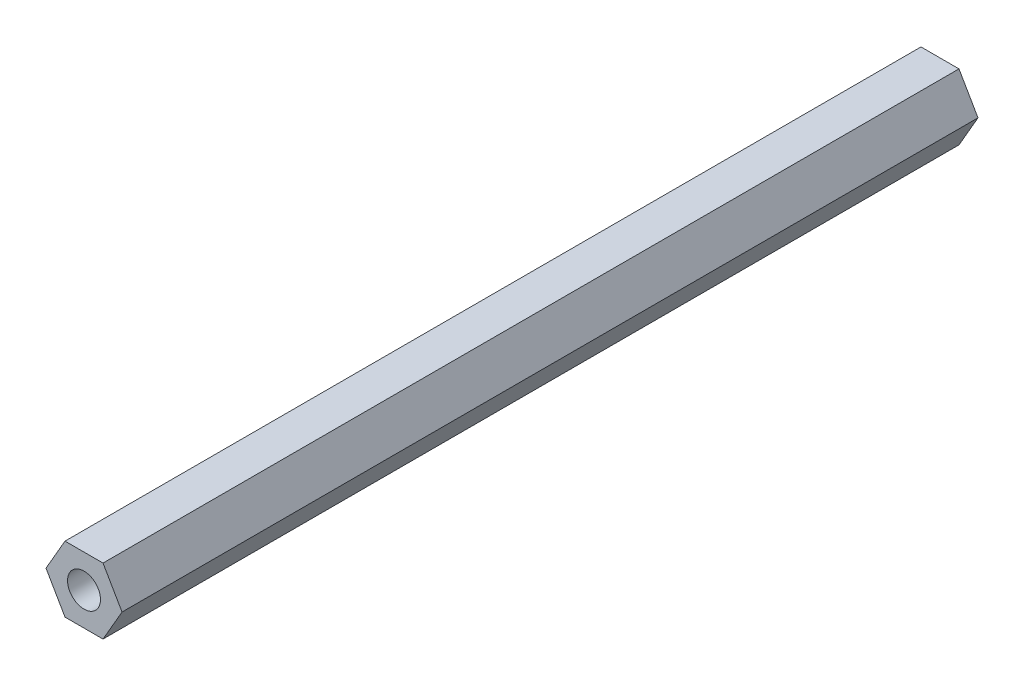
ISO-10303-21;
HEADER;
FILE_DESCRIPTION(('STEP AP214'),'2;1');
FILE_NAME('part.step','',(''),(''),'','','');
FILE_SCHEMA(('AUTOMOTIVE_DESIGN { 1 0 10303 214 1 1 1 1 }'));
ENDSEC;
DATA;
#1=APPLICATION_CONTEXT('core data for automotive mechanical design processes');
#2=APPLICATION_PROTOCOL_DEFINITION('international standard','automotive_design',2000,#1);
#3=PRODUCT_CONTEXT('',#1,'mechanical');
#4=PRODUCT('Part','Part','',(#3));
#5=PRODUCT_RELATED_PRODUCT_CATEGORY('part','',(#4));
#6=PRODUCT_DEFINITION_FORMATION('','',#4);
#7=PRODUCT_DEFINITION_CONTEXT('part definition',#1,'design');
#8=PRODUCT_DEFINITION('design','',#6,#7);
#9=PRODUCT_DEFINITION_SHAPE('','',#8);
#10=(LENGTH_UNIT() NAMED_UNIT(*) SI_UNIT(.MILLI.,.METRE.));
#11=(NAMED_UNIT(*) PLANE_ANGLE_UNIT() SI_UNIT($,.RADIAN.));
#12=(NAMED_UNIT(*) SI_UNIT($,.STERADIAN.) SOLID_ANGLE_UNIT());
#13=UNCERTAINTY_MEASURE_WITH_UNIT(LENGTH_MEASURE(1.E-05),#10,'distance_accuracy_value','');
#14=(GEOMETRIC_REPRESENTATION_CONTEXT(3) GLOBAL_UNCERTAINTY_ASSIGNED_CONTEXT((#13)) GLOBAL_UNIT_ASSIGNED_CONTEXT((#10,
#11,#12)) REPRESENTATION_CONTEXT('',''));
#15=CARTESIAN_POINT('',(0.,0.,0.));
#16=DIRECTION('',(0.,0.,1.));
#17=DIRECTION('',(1.,0.,0.));
#18=AXIS2_PLACEMENT_3D('',#15,#16,#17);
#19=CARTESIAN_POINT('',(0.,-2.5,65.));
#20=DIRECTION('',(0.,1.,0.));
#21=DIRECTION('',(-1.,0.,0.));
#22=AXIS2_PLACEMENT_3D('',#19,#20,#21);
#23=PLANE('',#22);
#24=DIRECTION('',(1.,0.,0.));
#25=VECTOR('',#24,1.);
#26=CARTESIAN_POINT('',(0.,-2.5,0.));
#27=LINE('',#26,#25);
#28=CARTESIAN_POINT('',(-1.44337567297404,-2.50000000000002,0.));
#29=VERTEX_POINT('',#28);
#30=CARTESIAN_POINT('',(1.44337567297409,-2.49999999999998,0.));
#31=VERTEX_POINT('',#30);
#32=EDGE_CURVE('E131',#29,#31,#27,.T.);
#33=ORIENTED_EDGE('',*,*,#32,.T.);
#34=DIRECTION('',(0.,0.,-1.));
#35=VECTOR('',#34,1.);
#36=CARTESIAN_POINT('',(1.44337567297409,-2.49999999999998,65.));
#37=LINE('',#36,#35);
#38=CARTESIAN_POINT('',(1.44337567297409,-2.49999999999998,65.));
#39=VERTEX_POINT('',#38);
#40=EDGE_CURVE('E11',#39,#31,#37,.T.);
#41=ORIENTED_EDGE('',*,*,#40,.F.);
#42=DIRECTION('',(1.,0.,0.));
#43=VECTOR('',#42,1.);
#44=CARTESIAN_POINT('',(0.,-2.5,65.));
#45=LINE('',#44,#43);
#46=CARTESIAN_POINT('',(-1.44337567297404,-2.50000000000002,65.));
#47=VERTEX_POINT('',#46);
#48=EDGE_CURVE('E142',#47,#39,#45,.T.);
#49=ORIENTED_EDGE('',*,*,#48,.F.);
#50=DIRECTION('',(0.,0.,-1.));
#51=VECTOR('',#50,1.);
#52=CARTESIAN_POINT('',(-1.44337567297404,-2.50000000000002,65.));
#53=LINE('',#52,#51);
#54=EDGE_CURVE('E127',#47,#29,#53,.T.);
#55=ORIENTED_EDGE('',*,*,#54,.T.);
#56=EDGE_LOOP('',(#33,#41,#49,#55));
#57=FACE_BOUND('',#56,.T.);
#58=ADVANCED_FACE('F45',(#57),#23,.F.);
#59=CARTESIAN_POINT('',(2.16506350946111,-1.24999999999999,65.));
#60=DIRECTION('',(-0.866025403784441,0.499999999999995,0.));
#61=DIRECTION('',(-0.499999999999995,-0.866025403784442,0.));
#62=AXIS2_PLACEMENT_3D('',#59,#60,#61);
#63=PLANE('',#62);
#64=DIRECTION('',(0.499999999999995,0.866025403784442,0.));
#65=VECTOR('',#64,1.);
#66=CARTESIAN_POINT('',(2.16506350946111,-1.24999999999999,0.));
#67=LINE('',#66,#65);
#68=CARTESIAN_POINT('',(2.88675134594813,0.,0.));
#69=VERTEX_POINT('',#68);
#70=EDGE_CURVE('E134',#31,#69,#67,.T.);
#71=ORIENTED_EDGE('',*,*,#70,.T.);
#72=DIRECTION('',(0.,0.,-1.));
#73=VECTOR('',#72,1.);
#74=CARTESIAN_POINT('',(2.88675134594813,0.,65.));
#75=LINE('',#74,#73);
#76=CARTESIAN_POINT('',(2.88675134594813,0.,65.));
#77=VERTEX_POINT('',#76);
#78=EDGE_CURVE('E53',#77,#69,#75,.T.);
#79=ORIENTED_EDGE('',*,*,#78,.F.);
#80=DIRECTION('',(0.499999999999995,0.866025403784442,0.));
#81=VECTOR('',#80,1.);
#82=CARTESIAN_POINT('',(2.16506350946111,-1.24999999999999,65.));
#83=LINE('',#82,#81);
#84=EDGE_CURVE('E99',#39,#77,#83,.T.);
#85=ORIENTED_EDGE('',*,*,#84,.F.);
#86=ORIENTED_EDGE('',*,*,#40,.T.);
#87=EDGE_LOOP('',(#71,#79,#85,#86));
#88=FACE_BOUND('',#87,.T.);
#89=ADVANCED_FACE('F167',(#88),#63,.F.);
#90=CARTESIAN_POINT('',(2.1650635094611,1.25,65.));
#91=DIRECTION('',(-0.866025403784438,-0.500000000000001,0.));
#92=DIRECTION('',(0.500000000000001,-0.866025403784438,0.));
#93=AXIS2_PLACEMENT_3D('',#90,#91,#92);
#94=PLANE('',#93);
#95=DIRECTION('',(-0.500000000000001,0.866025403784438,0.));
#96=VECTOR('',#95,1.);
#97=CARTESIAN_POINT('',(2.1650635094611,1.25,0.));
#98=LINE('',#97,#96);
#99=CARTESIAN_POINT('',(1.44337567297406,2.50000000000001,0.));
#100=VERTEX_POINT('',#99);
#101=EDGE_CURVE('E137',#69,#100,#98,.T.);
#102=ORIENTED_EDGE('',*,*,#101,.T.);
#103=DIRECTION('',(0.,0.,-1.));
#104=VECTOR('',#103,1.);
#105=CARTESIAN_POINT('',(1.44337567297406,2.50000000000001,65.));
#106=LINE('',#105,#104);
#107=CARTESIAN_POINT('',(1.44337567297406,2.50000000000001,65.));
#108=VERTEX_POINT('',#107);
#109=EDGE_CURVE('E122',#108,#100,#106,.T.);
#110=ORIENTED_EDGE('',*,*,#109,.F.);
#111=DIRECTION('',(-0.500000000000001,0.866025403784438,0.));
#112=VECTOR('',#111,1.);
#113=CARTESIAN_POINT('',(2.1650635094611,1.25,65.));
#114=LINE('',#113,#112);
#115=EDGE_CURVE('E113',#77,#108,#114,.T.);
#116=ORIENTED_EDGE('',*,*,#115,.F.);
#117=ORIENTED_EDGE('',*,*,#78,.T.);
#118=EDGE_LOOP('',(#102,#110,#116,#117));
#119=FACE_BOUND('',#118,.T.);
#120=ADVANCED_FACE('F148',(#119),#94,.F.);
#121=CARTESIAN_POINT('',(0.,2.5,65.));
#122=DIRECTION('',(0.,-1.,0.));
#123=DIRECTION('',(1.,0.,0.));
#124=AXIS2_PLACEMENT_3D('',#121,#122,#123);
#125=PLANE('',#124);
#126=DIRECTION('',(-1.,0.,0.));
#127=VECTOR('',#126,1.);
#128=CARTESIAN_POINT('',(0.,2.5,0.));
#129=LINE('',#128,#127);
#130=CARTESIAN_POINT('',(-1.44337567297408,2.49999999999999,0.));
#131=VERTEX_POINT('',#130);
#132=EDGE_CURVE('E121',#100,#131,#129,.T.);
#133=ORIENTED_EDGE('',*,*,#132,.T.);
#134=DIRECTION('',(0.,0.,-1.));
#135=VECTOR('',#134,1.);
#136=CARTESIAN_POINT('',(-1.44337567297408,2.49999999999999,65.));
#137=LINE('',#136,#135);
#138=CARTESIAN_POINT('',(-1.44337567297408,2.49999999999999,65.));
#139=VERTEX_POINT('',#138);
#140=EDGE_CURVE('E118',#139,#131,#137,.T.);
#141=ORIENTED_EDGE('',*,*,#140,.F.);
#142=DIRECTION('',(-1.,0.,0.));
#143=VECTOR('',#142,1.);
#144=CARTESIAN_POINT('',(0.,2.5,65.));
#145=LINE('',#144,#143);
#146=EDGE_CURVE('E107',#108,#139,#145,.T.);
#147=ORIENTED_EDGE('',*,*,#146,.F.);
#148=ORIENTED_EDGE('',*,*,#109,.T.);
#149=EDGE_LOOP('',(#133,#141,#147,#148));
#150=FACE_BOUND('',#149,.T.);
#151=ADVANCED_FACE('F119',(#150),#125,.F.);
#152=CARTESIAN_POINT('',(-2.1650635094611,1.24999999999999,65.));
#153=DIRECTION('',(0.866025403784441,-0.499999999999995,0.));
#154=DIRECTION('',(0.499999999999995,0.866025403784441,0.));
#155=AXIS2_PLACEMENT_3D('',#152,#153,#154);
#156=PLANE('',#155);
#157=DIRECTION('',(-0.499999999999995,-0.866025403784441,0.));
#158=VECTOR('',#157,1.);
#159=CARTESIAN_POINT('',(-2.1650635094611,1.24999999999999,0.));
#160=LINE('',#159,#158);
#161=CARTESIAN_POINT('',(-2.88675134594813,0.,0.));
#162=VERTEX_POINT('',#161);
#163=EDGE_CURVE('E85',#131,#162,#160,.T.);
#164=ORIENTED_EDGE('',*,*,#163,.T.);
#165=DIRECTION('',(0.,0.,-1.));
#166=VECTOR('',#165,1.);
#167=CARTESIAN_POINT('',(-2.88675134594813,0.,65.));
#168=LINE('',#167,#166);
#169=CARTESIAN_POINT('',(-2.88675134594813,0.,65.));
#170=VERTEX_POINT('',#169);
#171=EDGE_CURVE('E123',#170,#162,#168,.T.);
#172=ORIENTED_EDGE('',*,*,#171,.F.);
#173=DIRECTION('',(-0.499999999999995,-0.866025403784441,0.));
#174=VECTOR('',#173,1.);
#175=CARTESIAN_POINT('',(-2.1650635094611,1.24999999999999,65.));
#176=LINE('',#175,#174);
#177=EDGE_CURVE('E111',#139,#170,#176,.T.);
#178=ORIENTED_EDGE('',*,*,#177,.F.);
#179=ORIENTED_EDGE('',*,*,#140,.T.);
#180=EDGE_LOOP('',(#164,#172,#178,#179));
#181=FACE_BOUND('',#180,.T.);
#182=ADVANCED_FACE('F125',(#181),#156,.F.);
#183=CARTESIAN_POINT('',(-2.16506350946109,-1.25000000000002,65.));
#184=DIRECTION('',(0.866025403784434,0.500000000000007,0.));
#185=DIRECTION('',(-0.500000000000007,0.866025403784435,0.));
#186=AXIS2_PLACEMENT_3D('',#183,#184,#185);
#187=PLANE('',#186);
#188=DIRECTION('',(0.500000000000007,-0.866025403784435,0.));
#189=VECTOR('',#188,1.);
#190=CARTESIAN_POINT('',(-2.16506350946109,-1.25000000000002,0.));
#191=LINE('',#190,#189);
#192=EDGE_CURVE('E91',#162,#29,#191,.T.);
#193=ORIENTED_EDGE('',*,*,#192,.T.);
#194=ORIENTED_EDGE('',*,*,#54,.F.);
#195=DIRECTION('',(0.500000000000007,-0.866025403784435,0.));
#196=VECTOR('',#195,1.);
#197=CARTESIAN_POINT('',(-2.16506350946109,-1.25000000000002,65.));
#198=LINE('',#197,#196);
#199=EDGE_CURVE('E61',#170,#47,#198,.T.);
#200=ORIENTED_EDGE('',*,*,#199,.F.);
#201=ORIENTED_EDGE('',*,*,#171,.T.);
#202=EDGE_LOOP('',(#193,#194,#200,#201));
#203=FACE_BOUND('',#202,.T.);
#204=ADVANCED_FACE('F155',(#203),#187,.F.);
#205=CARTESIAN_POINT('',(0.,0.,65.));
#206=DIRECTION('',(0.,0.,1.));
#207=DIRECTION('',(1.,0.,0.));
#208=AXIS2_PLACEMENT_3D('',#205,#206,#207);
#209=PLANE('',#208);
#210=CARTESIAN_POINT('',(0.,0.,65.));
#211=DIRECTION('',(0.,0.,1.));
#212=DIRECTION('',(1.,0.,0.));
#213=AXIS2_PLACEMENT_3D('',#210,#211,#212);
#214=CIRCLE('',#213,1.25);
#215=CARTESIAN_POINT('',(1.25,0.,65.));
#216=VERTEX_POINT('',#215);
#217=EDGE_CURVE('E269',#216,#216,#214,.T.);
#218=ORIENTED_EDGE('',*,*,#217,.F.);
#219=EDGE_LOOP('',(#218));
#220=FACE_BOUND('',#219,.T.);
#221=ORIENTED_EDGE('',*,*,#48,.T.);
#222=ORIENTED_EDGE('',*,*,#84,.T.);
#223=ORIENTED_EDGE('',*,*,#115,.T.);
#224=ORIENTED_EDGE('',*,*,#146,.T.);
#225=ORIENTED_EDGE('',*,*,#177,.T.);
#226=ORIENTED_EDGE('',*,*,#199,.T.);
#227=EDGE_LOOP('',(#221,#222,#223,#224,#225,#226));
#228=FACE_BOUND('',#227,.T.);
#229=ADVANCED_FACE('F109',(#220,#228),#209,.T.);
#230=CARTESIAN_POINT('',(0.,0.,0.));
#231=DIRECTION('',(0.,0.,1.));
#232=DIRECTION('',(1.,0.,0.));
#233=AXIS2_PLACEMENT_3D('',#230,#231,#232);
#234=PLANE('',#233);
#235=ORIENTED_EDGE('',*,*,#32,.F.);
#236=ORIENTED_EDGE('',*,*,#192,.F.);
#237=ORIENTED_EDGE('',*,*,#163,.F.);
#238=ORIENTED_EDGE('',*,*,#132,.F.);
#239=ORIENTED_EDGE('',*,*,#101,.F.);
#240=ORIENTED_EDGE('',*,*,#70,.F.);
#241=EDGE_LOOP('',(#235,#236,#237,#238,#239,#240));
#242=FACE_BOUND('',#241,.T.);
#243=ADVANCED_FACE('F151',(#242),#234,.F.);
#244=CARTESIAN_POINT('',(0.,0.,57.5));
#245=DIRECTION('',(0.,0.,1.));
#246=DIRECTION('',(1.,0.,0.));
#247=AXIS2_PLACEMENT_3D('',#244,#245,#246);
#248=CONICAL_SURFACE('',#247,1.25,1.02974425867665);
#249=CARTESIAN_POINT('',(0.,0.,56.7489242262155));
#250=VERTEX_POINT('',#249);
#251=VERTEX_LOOP('',#250);
#252=FACE_BOUND('',#251,.T.);
#253=CARTESIAN_POINT('',(0.,0.,57.5));
#254=DIRECTION('',(0.,0.,1.));
#255=DIRECTION('',(1.,0.,0.));
#256=AXIS2_PLACEMENT_3D('',#253,#254,#255);
#257=CIRCLE('',#256,1.25);
#258=CARTESIAN_POINT('',(1.25,0.,57.5));
#259=VERTEX_POINT('',#258);
#260=EDGE_CURVE('E135',#259,#259,#257,.T.);
#261=ORIENTED_EDGE('',*,*,#260,.T.);
#262=EDGE_LOOP('',(#261));
#263=FACE_BOUND('',#262,.T.);
#264=ADVANCED_FACE('F201',(#252,#263),#248,.F.);
#265=CARTESIAN_POINT('',(0.,0.,65.));
#266=DIRECTION('',(0.,0.,1.));
#267=DIRECTION('',(1.,0.,0.));
#268=AXIS2_PLACEMENT_3D('',#265,#266,#267);
#269=CYLINDRICAL_SURFACE('',#268,1.25);
#270=ORIENTED_EDGE('',*,*,#260,.F.);
#271=EDGE_LOOP('',(#270));
#272=FACE_BOUND('',#271,.T.);
#273=ORIENTED_EDGE('',*,*,#217,.T.);
#274=EDGE_LOOP('',(#273));
#275=FACE_BOUND('',#274,.T.);
#276=ADVANCED_FACE('F216',(#272,#275),#269,.F.);
#277=CLOSED_SHELL('',(#58,#89,#120,#151,#182,#204,#229,#243,#264,#276));
#278=MANIFOLD_SOLID_BREP('B2',#277);
#279=ADVANCED_BREP_SHAPE_REPRESENTATION('',(#18,#278),#14);
#280=SHAPE_DEFINITION_REPRESENTATION(#9,#279);
ENDSEC;
END-ISO-10303-21;
